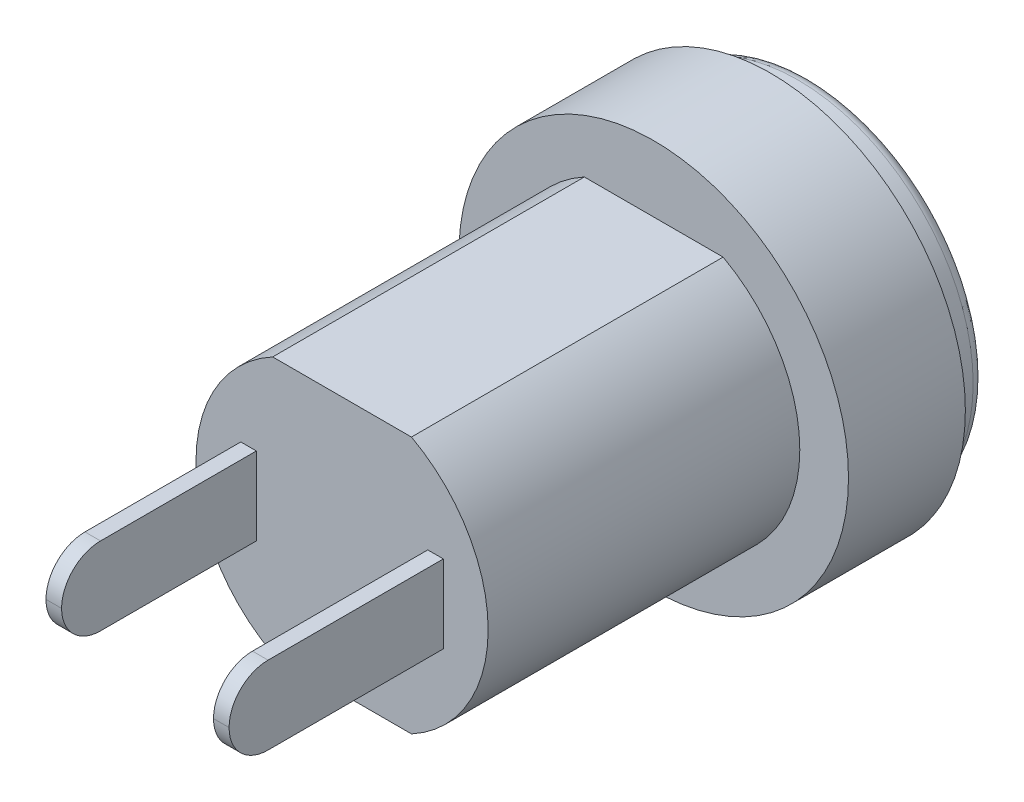
ISO-10303-21;
HEADER;
FILE_DESCRIPTION(('STEP AP214'),'2;1');
FILE_NAME('part.step','',(''),(''),'','','');
FILE_SCHEMA(('AUTOMOTIVE_DESIGN { 1 0 10303 214 1 1 1 1 }'));
ENDSEC;
DATA;
#1=APPLICATION_CONTEXT('core data for automotive mechanical design processes');
#2=APPLICATION_PROTOCOL_DEFINITION('international standard','automotive_design',2000,#1);
#3=PRODUCT_CONTEXT('',#1,'mechanical');
#4=PRODUCT('Part','Part','',(#3));
#5=PRODUCT_RELATED_PRODUCT_CATEGORY('part','',(#4));
#6=PRODUCT_DEFINITION_FORMATION('','',#4);
#7=PRODUCT_DEFINITION_CONTEXT('part definition',#1,'design');
#8=PRODUCT_DEFINITION('design','',#6,#7);
#9=PRODUCT_DEFINITION_SHAPE('','',#8);
#10=(LENGTH_UNIT() NAMED_UNIT(*) SI_UNIT(.MILLI.,.METRE.));
#11=(NAMED_UNIT(*) PLANE_ANGLE_UNIT() SI_UNIT($,.RADIAN.));
#12=(NAMED_UNIT(*) SI_UNIT($,.STERADIAN.) SOLID_ANGLE_UNIT());
#13=UNCERTAINTY_MEASURE_WITH_UNIT(LENGTH_MEASURE(1.E-05),#10,'distance_accuracy_value','');
#14=(GEOMETRIC_REPRESENTATION_CONTEXT(3) GLOBAL_UNCERTAINTY_ASSIGNED_CONTEXT((#13)) GLOBAL_UNIT_ASSIGNED_CONTEXT((#10,
#11,#12)) REPRESENTATION_CONTEXT('',''));
#15=CARTESIAN_POINT('',(0.,0.,0.));
#16=DIRECTION('',(0.,0.,1.));
#17=DIRECTION('',(1.,0.,0.));
#18=AXIS2_PLACEMENT_3D('',#15,#16,#17);
#19=CARTESIAN_POINT('',(0.,0.,11.));
#20=DIRECTION('',(0.,0.,1.));
#21=DIRECTION('',(1.,0.,0.));
#22=AXIS2_PLACEMENT_3D('',#19,#20,#21);
#23=PLANE('',#22);
#24=DIRECTION('',(-1.,0.,0.));
#25=VECTOR('',#24,1.);
#26=CARTESIAN_POINT('',(0.,-3.3,11.));
#27=LINE('',#26,#25);
#28=CARTESIAN_POINT('',(1.78115131305569,-3.3,11.));
#29=VERTEX_POINT('',#28);
#30=CARTESIAN_POINT('',(-1.78115131305569,-3.3,11.));
#31=VERTEX_POINT('',#30);
#32=EDGE_CURVE('E206',#29,#31,#27,.T.);
#33=ORIENTED_EDGE('',*,*,#32,.F.);
#34=CARTESIAN_POINT('',(0.,0.,11.));
#35=DIRECTION('',(0.,0.,1.));
#36=DIRECTION('',(1.,0.,0.));
#37=AXIS2_PLACEMENT_3D('',#34,#35,#36);
#38=CIRCLE('',#37,3.75);
#39=CARTESIAN_POINT('',(1.78115131305569,3.3,11.));
#40=VERTEX_POINT('',#39);
#41=EDGE_CURVE('E191',#29,#40,#38,.T.);
#42=ORIENTED_EDGE('',*,*,#41,.T.);
#43=DIRECTION('',(1.,0.,0.));
#44=VECTOR('',#43,1.);
#45=CARTESIAN_POINT('',(0.,3.3,11.));
#46=LINE('',#45,#44);
#47=CARTESIAN_POINT('',(-1.78115131305569,3.3,11.));
#48=VERTEX_POINT('',#47);
#49=EDGE_CURVE('E203',#48,#40,#46,.T.);
#50=ORIENTED_EDGE('',*,*,#49,.F.);
#51=EDGE_CURVE('E189',#48,#31,#38,.T.);
#52=ORIENTED_EDGE('',*,*,#51,.T.);
#53=EDGE_LOOP('',(#33,#42,#50,#52));
#54=FACE_BOUND('',#53,.T.);
#55=DIRECTION('',(-1.,0.,0.));
#56=VECTOR('',#55,1.);
#57=CARTESIAN_POINT('',(-2.6,1.,11.));
#58=LINE('',#57,#56);
#59=CARTESIAN_POINT('',(-2.2,1.,11.));
#60=VERTEX_POINT('',#59);
#61=CARTESIAN_POINT('',(-2.6,1.,11.));
#62=VERTEX_POINT('',#61);
#63=EDGE_CURVE('E156',#60,#62,#58,.T.);
#64=ORIENTED_EDGE('',*,*,#63,.F.);
#65=DIRECTION('',(0.,1.,0.));
#66=VECTOR('',#65,1.);
#67=CARTESIAN_POINT('',(-2.2,-1.,11.));
#68=LINE('',#67,#66);
#69=CARTESIAN_POINT('',(-2.2,-1.,11.));
#70=VERTEX_POINT('',#69);
#71=EDGE_CURVE('E127',#70,#60,#68,.T.);
#72=ORIENTED_EDGE('',*,*,#71,.F.);
#73=DIRECTION('',(1.,0.,0.));
#74=VECTOR('',#73,1.);
#75=CARTESIAN_POINT('',(-2.6,-1.,11.));
#76=LINE('',#75,#74);
#77=CARTESIAN_POINT('',(-2.6,-1.,11.));
#78=VERTEX_POINT('',#77);
#79=EDGE_CURVE('E165',#78,#70,#76,.T.);
#80=ORIENTED_EDGE('',*,*,#79,.F.);
#81=DIRECTION('',(0.,-1.,0.));
#82=VECTOR('',#81,1.);
#83=CARTESIAN_POINT('',(-2.6,-1.,11.));
#84=LINE('',#83,#82);
#85=EDGE_CURVE('E157',#62,#78,#84,.T.);
#86=ORIENTED_EDGE('',*,*,#85,.F.);
#87=EDGE_LOOP('',(#64,#72,#80,#86));
#88=FACE_BOUND('',#87,.T.);
#89=DIRECTION('',(-1.,0.,0.));
#90=VECTOR('',#89,1.);
#91=CARTESIAN_POINT('',(2.6,1.,11.));
#92=LINE('',#91,#90);
#93=CARTESIAN_POINT('',(2.6,1.,11.));
#94=VERTEX_POINT('',#93);
#95=CARTESIAN_POINT('',(2.2,1.,11.));
#96=VERTEX_POINT('',#95);
#97=EDGE_CURVE('E123',#94,#96,#92,.T.);
#98=ORIENTED_EDGE('',*,*,#97,.F.);
#99=DIRECTION('',(0.,1.,0.));
#100=VECTOR('',#99,1.);
#101=CARTESIAN_POINT('',(2.6,-1.,11.));
#102=LINE('',#101,#100);
#103=CARTESIAN_POINT('',(2.6,-1.,11.));
#104=VERTEX_POINT('',#103);
#105=EDGE_CURVE('E132',#104,#94,#102,.T.);
#106=ORIENTED_EDGE('',*,*,#105,.F.);
#107=DIRECTION('',(1.,0.,0.));
#108=VECTOR('',#107,1.);
#109=CARTESIAN_POINT('',(2.6,-1.,11.));
#110=LINE('',#109,#108);
#111=CARTESIAN_POINT('',(2.2,-1.,11.));
#112=VERTEX_POINT('',#111);
#113=EDGE_CURVE('E144',#112,#104,#110,.T.);
#114=ORIENTED_EDGE('',*,*,#113,.F.);
#115=DIRECTION('',(0.,-1.,0.));
#116=VECTOR('',#115,1.);
#117=CARTESIAN_POINT('',(2.2,-1.,11.));
#118=LINE('',#117,#116);
#119=EDGE_CURVE('E141',#96,#112,#118,.T.);
#120=ORIENTED_EDGE('',*,*,#119,.F.);
#121=EDGE_LOOP('',(#98,#106,#114,#120));
#122=FACE_BOUND('',#121,.T.);
#123=ADVANCED_FACE('F19',(#54,#88,#122),#23,.T.);
#124=CARTESIAN_POINT('',(0.,0.,11.));
#125=DIRECTION('',(0.,0.,-1.));
#126=DIRECTION('',(-1.,0.,0.));
#127=AXIS2_PLACEMENT_3D('',#124,#125,#126);
#128=CYLINDRICAL_SURFACE('',#127,3.75);
#129=ORIENTED_EDGE('',*,*,#41,.F.);
#130=DIRECTION('',(0.,0.,-1.));
#131=VECTOR('',#130,1.);
#132=CARTESIAN_POINT('',(1.78115131305569,-3.3,11.));
#133=LINE('',#132,#131);
#134=CARTESIAN_POINT('',(1.78115131305569,-3.3,3.));
#135=VERTEX_POINT('',#134);
#136=EDGE_CURVE('E180',#29,#135,#133,.T.);
#137=ORIENTED_EDGE('',*,*,#136,.T.);
#138=CARTESIAN_POINT('',(0.,0.,3.));
#139=DIRECTION('',(0.,0.,1.));
#140=DIRECTION('',(1.,0.,0.));
#141=AXIS2_PLACEMENT_3D('',#138,#139,#140);
#142=CIRCLE('',#141,3.75);
#143=CARTESIAN_POINT('',(1.78115131305569,3.3,3.));
#144=VERTEX_POINT('',#143);
#145=EDGE_CURVE('E188',#135,#144,#142,.T.);
#146=ORIENTED_EDGE('',*,*,#145,.T.);
#147=DIRECTION('',(0.,0.,-1.));
#148=VECTOR('',#147,1.);
#149=CARTESIAN_POINT('',(1.78115131305569,3.3,11.));
#150=LINE('',#149,#148);
#151=EDGE_CURVE('E183',#144,#40,#150,.F.);
#152=ORIENTED_EDGE('',*,*,#151,.T.);
#153=EDGE_LOOP('',(#129,#137,#146,#152));
#154=FACE_BOUND('',#153,.T.);
#155=ADVANCED_FACE('F262',(#154),#128,.T.);
#156=CARTESIAN_POINT('',(0.,0.,3.));
#157=DIRECTION('',(0.,0.,-1.));
#158=DIRECTION('',(-1.,0.,0.));
#159=AXIS2_PLACEMENT_3D('',#156,#157,#158);
#160=CYLINDRICAL_SURFACE('',#159,5.);
#161=CARTESIAN_POINT('',(0.,0.,3.));
#162=DIRECTION('',(0.,0.,1.));
#163=DIRECTION('',(1.,0.,0.));
#164=AXIS2_PLACEMENT_3D('',#161,#162,#163);
#165=CIRCLE('',#164,5.);
#166=CARTESIAN_POINT('',(5.,0.,3.));
#167=VERTEX_POINT('',#166);
#168=EDGE_CURVE('E196',#167,#167,#165,.T.);
#169=ORIENTED_EDGE('',*,*,#168,.F.);
#170=EDGE_LOOP('',(#169));
#171=FACE_BOUND('',#170,.T.);
#172=CARTESIAN_POINT('',(0.,0.,0.));
#173=DIRECTION('',(0.,0.,1.));
#174=DIRECTION('',(1.,0.,0.));
#175=AXIS2_PLACEMENT_3D('',#172,#173,#174);
#176=CIRCLE('',#175,5.);
#177=CARTESIAN_POINT('',(5.,0.,0.));
#178=VERTEX_POINT('',#177);
#179=EDGE_CURVE('E194',#178,#178,#176,.T.);
#180=ORIENTED_EDGE('',*,*,#179,.T.);
#181=EDGE_LOOP('',(#180));
#182=FACE_BOUND('',#181,.T.);
#183=ADVANCED_FACE('F275',(#171,#182),#160,.T.);
#184=CARTESIAN_POINT('',(0.,0.,3.));
#185=DIRECTION('',(0.,0.,1.));
#186=DIRECTION('',(1.,0.,0.));
#187=AXIS2_PLACEMENT_3D('',#184,#185,#186);
#188=PLANE('',#187);
#189=ORIENTED_EDGE('',*,*,#145,.F.);
#190=DIRECTION('',(1.,0.,0.));
#191=VECTOR('',#190,1.);
#192=CARTESIAN_POINT('',(-4.,-3.3,3.));
#193=LINE('',#192,#191);
#194=CARTESIAN_POINT('',(-1.78115131305569,-3.3,3.));
#195=VERTEX_POINT('',#194);
#196=EDGE_CURVE('E174',#195,#135,#193,.T.);
#197=ORIENTED_EDGE('',*,*,#196,.F.);
#198=CARTESIAN_POINT('',(-1.78115131305569,3.3,3.));
#199=VERTEX_POINT('',#198);
#200=EDGE_CURVE('E193',#199,#195,#142,.T.);
#201=ORIENTED_EDGE('',*,*,#200,.F.);
#202=DIRECTION('',(-1.,0.,0.));
#203=VECTOR('',#202,1.);
#204=CARTESIAN_POINT('',(-4.,3.3,3.));
#205=LINE('',#204,#203);
#206=EDGE_CURVE('E185',#144,#199,#205,.T.);
#207=ORIENTED_EDGE('',*,*,#206,.F.);
#208=EDGE_LOOP('',(#189,#197,#201,#207));
#209=FACE_BOUND('',#208,.T.);
#210=ORIENTED_EDGE('',*,*,#168,.T.);
#211=EDGE_LOOP('',(#210));
#212=FACE_BOUND('',#211,.T.);
#213=ADVANCED_FACE('F285',(#209,#212),#188,.T.);
#214=CARTESIAN_POINT('',(0.,0.,0.));
#215=DIRECTION('',(0.,0.,1.));
#216=DIRECTION('',(1.,0.,0.));
#217=AXIS2_PLACEMENT_3D('',#214,#215,#216);
#218=PLANE('',#217);
#219=CARTESIAN_POINT('',(0.,0.,0.));
#220=DIRECTION('',(0.,0.,1.));
#221=DIRECTION('',(1.,0.,0.));
#222=AXIS2_PLACEMENT_3D('',#219,#220,#221);
#223=CIRCLE('',#222,4.5);
#224=CARTESIAN_POINT('',(4.5,0.,0.));
#225=VERTEX_POINT('',#224);
#226=EDGE_CURVE('E230',#225,#225,#223,.F.);
#227=ORIENTED_EDGE('',*,*,#226,.F.);
#228=EDGE_LOOP('',(#227));
#229=FACE_BOUND('',#228,.T.);
#230=ORIENTED_EDGE('',*,*,#179,.F.);
#231=EDGE_LOOP('',(#230));
#232=FACE_BOUND('',#231,.T.);
#233=ADVANCED_FACE('F284',(#229,#232),#218,.F.);
#234=ORIENTED_EDGE('',*,*,#200,.T.);
#235=DIRECTION('',(0.,0.,-1.));
#236=VECTOR('',#235,1.);
#237=CARTESIAN_POINT('',(-1.78115131305569,-3.3,11.));
#238=LINE('',#237,#236);
#239=EDGE_CURVE('E175',#195,#31,#238,.F.);
#240=ORIENTED_EDGE('',*,*,#239,.T.);
#241=ORIENTED_EDGE('',*,*,#51,.F.);
#242=DIRECTION('',(0.,0.,-1.));
#243=VECTOR('',#242,1.);
#244=CARTESIAN_POINT('',(-1.78115131305569,3.3,11.));
#245=LINE('',#244,#243);
#246=EDGE_CURVE('E186',#48,#199,#245,.T.);
#247=ORIENTED_EDGE('',*,*,#246,.T.);
#248=EDGE_LOOP('',(#234,#240,#241,#247));
#249=FACE_BOUND('',#248,.T.);
#250=ADVANCED_FACE('F274',(#249),#128,.T.);
#251=CARTESIAN_POINT('',(-4.,3.3,-5.0504658250315));
#252=DIRECTION('',(0.,-1.,0.));
#253=DIRECTION('',(0.,0.,-1.));
#254=AXIS2_PLACEMENT_3D('',#251,#252,#253);
#255=PLANE('',#254);
#256=ORIENTED_EDGE('',*,*,#49,.T.);
#257=ORIENTED_EDGE('',*,*,#151,.F.);
#258=ORIENTED_EDGE('',*,*,#206,.T.);
#259=ORIENTED_EDGE('',*,*,#246,.F.);
#260=EDGE_LOOP('',(#256,#257,#258,#259));
#261=FACE_BOUND('',#260,.T.);
#262=ADVANCED_FACE('F276',(#261),#255,.F.);
#263=CARTESIAN_POINT('',(-4.,-3.3,-5.0504658250315));
#264=DIRECTION('',(0.,1.,0.));
#265=DIRECTION('',(0.,0.,1.));
#266=AXIS2_PLACEMENT_3D('',#263,#264,#265);
#267=PLANE('',#266);
#268=ORIENTED_EDGE('',*,*,#32,.T.);
#269=ORIENTED_EDGE('',*,*,#239,.F.);
#270=ORIENTED_EDGE('',*,*,#196,.T.);
#271=ORIENTED_EDGE('',*,*,#136,.F.);
#272=EDGE_LOOP('',(#268,#269,#270,#271));
#273=FACE_BOUND('',#272,.T.);
#274=ADVANCED_FACE('F374',(#273),#267,.F.);
#275=CARTESIAN_POINT('',(-2.2,-1.,16.));
#276=DIRECTION('',(-1.,0.,0.));
#277=DIRECTION('',(0.,0.,1.));
#278=AXIS2_PLACEMENT_3D('',#275,#276,#277);
#279=PLANE('',#278);
#280=DIRECTION('',(0.,0.,-1.));
#281=VECTOR('',#280,1.);
#282=CARTESIAN_POINT('',(-2.2,1.,16.));
#283=LINE('',#282,#281);
#284=CARTESIAN_POINT('',(-2.2,1.,15.));
#285=VERTEX_POINT('',#284);
#286=EDGE_CURVE('E171',#285,#60,#283,.T.);
#287=ORIENTED_EDGE('',*,*,#286,.F.);
#288=CARTESIAN_POINT('',(-2.2,0.,15.));
#289=DIRECTION('',(-1.,0.,0.));
#290=DIRECTION('',(0.,0.,1.));
#291=AXIS2_PLACEMENT_3D('',#288,#289,#290);
#292=CIRCLE('',#291,1.);
#293=CARTESIAN_POINT('',(-2.2,0.,16.));
#294=VERTEX_POINT('',#293);
#295=EDGE_CURVE('E39',#285,#294,#292,.F.);
#296=ORIENTED_EDGE('',*,*,#295,.T.);
#297=CARTESIAN_POINT('',(-2.2,0.,15.));
#298=DIRECTION('',(-1.,0.,0.));
#299=DIRECTION('',(0.,0.,1.));
#300=AXIS2_PLACEMENT_3D('',#297,#298,#299);
#301=CIRCLE('',#300,1.);
#302=CARTESIAN_POINT('',(-2.2,-1.,15.));
#303=VERTEX_POINT('',#302);
#304=EDGE_CURVE('E35',#294,#303,#301,.F.);
#305=ORIENTED_EDGE('',*,*,#304,.T.);
#306=DIRECTION('',(0.,0.,-1.));
#307=VECTOR('',#306,1.);
#308=CARTESIAN_POINT('',(-2.2,-1.,16.));
#309=LINE('',#308,#307);
#310=EDGE_CURVE('E164',#303,#70,#309,.T.);
#311=ORIENTED_EDGE('',*,*,#310,.T.);
#312=ORIENTED_EDGE('',*,*,#71,.T.);
#313=EDGE_LOOP('',(#287,#296,#305,#311,#312));
#314=FACE_BOUND('',#313,.T.);
#315=ADVANCED_FACE('F375',(#314),#279,.F.);
#316=CARTESIAN_POINT('',(-2.6,1.,16.));
#317=DIRECTION('',(0.,-1.,0.));
#318=DIRECTION('',(0.,0.,-1.));
#319=AXIS2_PLACEMENT_3D('',#316,#317,#318);
#320=PLANE('',#319);
#321=DIRECTION('',(0.,0.,-1.));
#322=VECTOR('',#321,1.);
#323=CARTESIAN_POINT('',(-2.6,1.,16.));
#324=LINE('',#323,#322);
#325=CARTESIAN_POINT('',(-2.6,1.,15.));
#326=VERTEX_POINT('',#325);
#327=EDGE_CURVE('E166',#326,#62,#324,.T.);
#328=ORIENTED_EDGE('',*,*,#327,.F.);
#329=DIRECTION('',(-1.,0.,0.));
#330=VECTOR('',#329,1.);
#331=CARTESIAN_POINT('',(-2.6,1.,15.));
#332=LINE('',#331,#330);
#333=EDGE_CURVE('E224',#326,#285,#332,.F.);
#334=ORIENTED_EDGE('',*,*,#333,.T.);
#335=ORIENTED_EDGE('',*,*,#286,.T.);
#336=ORIENTED_EDGE('',*,*,#63,.T.);
#337=EDGE_LOOP('',(#328,#334,#335,#336));
#338=FACE_BOUND('',#337,.T.);
#339=ADVANCED_FACE('F366',(#338),#320,.F.);
#340=CARTESIAN_POINT('',(-2.6,-1.,16.));
#341=DIRECTION('',(1.,0.,0.));
#342=DIRECTION('',(0.,0.,-1.));
#343=AXIS2_PLACEMENT_3D('',#340,#341,#342);
#344=PLANE('',#343);
#345=CARTESIAN_POINT('',(-2.6,0.,15.));
#346=DIRECTION('',(1.,0.,0.));
#347=DIRECTION('',(0.,0.,-1.));
#348=AXIS2_PLACEMENT_3D('',#345,#346,#347);
#349=CIRCLE('',#348,1.);
#350=CARTESIAN_POINT('',(-2.6,-1.,15.));
#351=VERTEX_POINT('',#350);
#352=CARTESIAN_POINT('',(-2.6,0.,16.));
#353=VERTEX_POINT('',#352);
#354=EDGE_CURVE('E218',#351,#353,#349,.F.);
#355=ORIENTED_EDGE('',*,*,#354,.T.);
#356=CARTESIAN_POINT('',(-2.6,0.,15.));
#357=DIRECTION('',(1.,0.,0.));
#358=DIRECTION('',(0.,0.,-1.));
#359=AXIS2_PLACEMENT_3D('',#356,#357,#358);
#360=CIRCLE('',#359,1.);
#361=EDGE_CURVE('E222',#353,#326,#360,.F.);
#362=ORIENTED_EDGE('',*,*,#361,.T.);
#363=ORIENTED_EDGE('',*,*,#327,.T.);
#364=ORIENTED_EDGE('',*,*,#85,.T.);
#365=DIRECTION('',(0.,0.,-1.));
#366=VECTOR('',#365,1.);
#367=CARTESIAN_POINT('',(-2.6,-1.,16.));
#368=LINE('',#367,#366);
#369=EDGE_CURVE('E170',#351,#78,#368,.T.);
#370=ORIENTED_EDGE('',*,*,#369,.F.);
#371=EDGE_LOOP('',(#355,#362,#363,#364,#370));
#372=FACE_BOUND('',#371,.T.);
#373=ADVANCED_FACE('F365',(#372),#344,.F.);
#374=CARTESIAN_POINT('',(-2.6,-1.,16.));
#375=DIRECTION('',(0.,1.,0.));
#376=DIRECTION('',(0.,0.,1.));
#377=AXIS2_PLACEMENT_3D('',#374,#375,#376);
#378=PLANE('',#377);
#379=ORIENTED_EDGE('',*,*,#310,.F.);
#380=DIRECTION('',(1.,0.,0.));
#381=VECTOR('',#380,1.);
#382=CARTESIAN_POINT('',(-2.6,-1.,15.));
#383=LINE('',#382,#381);
#384=EDGE_CURVE('E229',#303,#351,#383,.F.);
#385=ORIENTED_EDGE('',*,*,#384,.T.);
#386=ORIENTED_EDGE('',*,*,#369,.T.);
#387=ORIENTED_EDGE('',*,*,#79,.T.);
#388=EDGE_LOOP('',(#379,#385,#386,#387));
#389=FACE_BOUND('',#388,.T.);
#390=ADVANCED_FACE('F363',(#389),#378,.F.);
#391=CARTESIAN_POINT('',(2.6,-1.,16.));
#392=DIRECTION('',(-1.,0.,0.));
#393=DIRECTION('',(0.,0.,1.));
#394=AXIS2_PLACEMENT_3D('',#391,#392,#393);
#395=PLANE('',#394);
#396=DIRECTION('',(0.,0.,-1.));
#397=VECTOR('',#396,1.);
#398=CARTESIAN_POINT('',(2.6,1.,16.));
#399=LINE('',#398,#397);
#400=CARTESIAN_POINT('',(2.6,1.,15.5));
#401=VERTEX_POINT('',#400);
#402=EDGE_CURVE('E118',#401,#94,#399,.T.);
#403=ORIENTED_EDGE('',*,*,#402,.F.);
#404=CARTESIAN_POINT('',(2.6,0.,15.5));
#405=DIRECTION('',(-1.,0.,0.));
#406=DIRECTION('',(0.,0.,1.));
#407=AXIS2_PLACEMENT_3D('',#404,#405,#406);
#408=CIRCLE('',#407,1.);
#409=CARTESIAN_POINT('',(2.6,0.,16.5));
#410=VERTEX_POINT('',#409);
#411=EDGE_CURVE('E214',#401,#410,#408,.F.);
#412=ORIENTED_EDGE('',*,*,#411,.T.);
#413=CARTESIAN_POINT('',(2.6,0.,15.5));
#414=DIRECTION('',(-1.,0.,0.));
#415=DIRECTION('',(0.,0.,1.));
#416=AXIS2_PLACEMENT_3D('',#413,#414,#415);
#417=CIRCLE('',#416,1.);
#418=CARTESIAN_POINT('',(2.6,-1.,15.5));
#419=VERTEX_POINT('',#418);
#420=EDGE_CURVE('E213',#410,#419,#417,.F.);
#421=ORIENTED_EDGE('',*,*,#420,.T.);
#422=DIRECTION('',(0.,0.,-1.));
#423=VECTOR('',#422,1.);
#424=CARTESIAN_POINT('',(2.6,-1.,16.));
#425=LINE('',#424,#423);
#426=EDGE_CURVE('E137',#419,#104,#425,.T.);
#427=ORIENTED_EDGE('',*,*,#426,.T.);
#428=ORIENTED_EDGE('',*,*,#105,.T.);
#429=EDGE_LOOP('',(#403,#412,#421,#427,#428));
#430=FACE_BOUND('',#429,.T.);
#431=ADVANCED_FACE('F133',(#430),#395,.F.);
#432=CARTESIAN_POINT('',(2.6,1.,16.));
#433=DIRECTION('',(0.,-1.,0.));
#434=DIRECTION('',(1.,0.,0.));
#435=AXIS2_PLACEMENT_3D('',#432,#433,#434);
#436=PLANE('',#435);
#437=DIRECTION('',(0.,0.,-1.));
#438=VECTOR('',#437,1.);
#439=CARTESIAN_POINT('',(2.2,1.,16.));
#440=LINE('',#439,#438);
#441=CARTESIAN_POINT('',(2.2,1.,15.5));
#442=VERTEX_POINT('',#441);
#443=EDGE_CURVE('E129',#442,#96,#440,.T.);
#444=ORIENTED_EDGE('',*,*,#443,.F.);
#445=DIRECTION('',(-1.,0.,0.));
#446=VECTOR('',#445,1.);
#447=CARTESIAN_POINT('',(2.6,1.,15.5));
#448=LINE('',#447,#446);
#449=EDGE_CURVE('E126',#442,#401,#448,.F.);
#450=ORIENTED_EDGE('',*,*,#449,.T.);
#451=ORIENTED_EDGE('',*,*,#402,.T.);
#452=ORIENTED_EDGE('',*,*,#97,.T.);
#453=EDGE_LOOP('',(#444,#450,#451,#452));
#454=FACE_BOUND('',#453,.T.);
#455=ADVANCED_FACE('F121',(#454),#436,.F.);
#456=CARTESIAN_POINT('',(2.2,-1.,16.));
#457=DIRECTION('',(1.,0.,0.));
#458=DIRECTION('',(0.,0.,-1.));
#459=AXIS2_PLACEMENT_3D('',#456,#457,#458);
#460=PLANE('',#459);
#461=CARTESIAN_POINT('',(2.2,0.,15.5));
#462=DIRECTION('',(1.,0.,0.));
#463=DIRECTION('',(0.,0.,-1.));
#464=AXIS2_PLACEMENT_3D('',#461,#462,#463);
#465=CIRCLE('',#464,1.);
#466=CARTESIAN_POINT('',(2.2,-1.,15.5));
#467=VERTEX_POINT('',#466);
#468=CARTESIAN_POINT('',(2.2,0.,16.5));
#469=VERTEX_POINT('',#468);
#470=EDGE_CURVE('E208',#467,#469,#465,.F.);
#471=ORIENTED_EDGE('',*,*,#470,.T.);
#472=CARTESIAN_POINT('',(2.2,0.,15.5));
#473=DIRECTION('',(1.,0.,0.));
#474=DIRECTION('',(0.,0.,-1.));
#475=AXIS2_PLACEMENT_3D('',#472,#473,#474);
#476=CIRCLE('',#475,1.);
#477=EDGE_CURVE('E209',#469,#442,#476,.F.);
#478=ORIENTED_EDGE('',*,*,#477,.T.);
#479=ORIENTED_EDGE('',*,*,#443,.T.);
#480=ORIENTED_EDGE('',*,*,#119,.T.);
#481=DIRECTION('',(0.,0.,-1.));
#482=VECTOR('',#481,1.);
#483=CARTESIAN_POINT('',(2.2,-1.,16.));
#484=LINE('',#483,#482);
#485=EDGE_CURVE('E151',#467,#112,#484,.T.);
#486=ORIENTED_EDGE('',*,*,#485,.F.);
#487=EDGE_LOOP('',(#471,#478,#479,#480,#486));
#488=FACE_BOUND('',#487,.T.);
#489=ADVANCED_FACE('F355',(#488),#460,.F.);
#490=CARTESIAN_POINT('',(2.6,-1.,16.));
#491=DIRECTION('',(0.,1.,0.));
#492=DIRECTION('',(-1.,0.,0.));
#493=AXIS2_PLACEMENT_3D('',#490,#491,#492);
#494=PLANE('',#493);
#495=ORIENTED_EDGE('',*,*,#426,.F.);
#496=DIRECTION('',(1.,0.,0.));
#497=VECTOR('',#496,1.);
#498=CARTESIAN_POINT('',(2.2,-1.,15.5));
#499=LINE('',#498,#497);
#500=EDGE_CURVE('E220',#419,#467,#499,.F.);
#501=ORIENTED_EDGE('',*,*,#500,.T.);
#502=ORIENTED_EDGE('',*,*,#485,.T.);
#503=ORIENTED_EDGE('',*,*,#113,.T.);
#504=EDGE_LOOP('',(#495,#501,#502,#503));
#505=FACE_BOUND('',#504,.T.);
#506=ADVANCED_FACE('F304',(#505),#494,.F.);
#507=CARTESIAN_POINT('',(0.,0.,15.5));
#508=DIRECTION('',(-1.,0.,0.));
#509=DIRECTION('',(0.,-1.,0.));
#510=AXIS2_PLACEMENT_3D('',#507,#508,#509);
#511=CYLINDRICAL_SURFACE('',#510,1.);
#512=ORIENTED_EDGE('',*,*,#500,.F.);
#513=ORIENTED_EDGE('',*,*,#420,.F.);
#514=DIRECTION('',(1.,0.,0.));
#515=VECTOR('',#514,1.);
#516=CARTESIAN_POINT('',(2.6,0.,16.5));
#517=LINE('',#516,#515);
#518=EDGE_CURVE('E138',#469,#410,#517,.T.);
#519=ORIENTED_EDGE('',*,*,#518,.F.);
#520=ORIENTED_EDGE('',*,*,#470,.F.);
#521=EDGE_LOOP('',(#512,#513,#519,#520));
#522=FACE_BOUND('',#521,.T.);
#523=ADVANCED_FACE('F298',(#522),#511,.T.);
#524=CARTESIAN_POINT('',(0.,0.,15.5));
#525=DIRECTION('',(1.,0.,0.));
#526=DIRECTION('',(0.,1.,0.));
#527=AXIS2_PLACEMENT_3D('',#524,#525,#526);
#528=CYLINDRICAL_SURFACE('',#527,1.);
#529=ORIENTED_EDGE('',*,*,#411,.F.);
#530=ORIENTED_EDGE('',*,*,#449,.F.);
#531=ORIENTED_EDGE('',*,*,#477,.F.);
#532=ORIENTED_EDGE('',*,*,#518,.T.);
#533=EDGE_LOOP('',(#529,#530,#531,#532));
#534=FACE_BOUND('',#533,.T.);
#535=ADVANCED_FACE('F294',(#534),#528,.T.);
#536=CARTESIAN_POINT('',(0.,0.,15.));
#537=DIRECTION('',(1.,0.,0.));
#538=DIRECTION('',(0.,0.,-1.));
#539=AXIS2_PLACEMENT_3D('',#536,#537,#538);
#540=CYLINDRICAL_SURFACE('',#539,1.);
#541=ORIENTED_EDGE('',*,*,#384,.F.);
#542=ORIENTED_EDGE('',*,*,#304,.F.);
#543=DIRECTION('',(1.,0.,0.));
#544=VECTOR('',#543,1.);
#545=CARTESIAN_POINT('',(0.,0.,16.));
#546=LINE('',#545,#544);
#547=EDGE_CURVE('E235',#353,#294,#546,.T.);
#548=ORIENTED_EDGE('',*,*,#547,.F.);
#549=ORIENTED_EDGE('',*,*,#354,.F.);
#550=EDGE_LOOP('',(#541,#542,#548,#549));
#551=FACE_BOUND('',#550,.T.);
#552=ADVANCED_FACE('F297',(#551),#540,.T.);
#553=CARTESIAN_POINT('',(0.,0.,15.));
#554=DIRECTION('',(-1.,0.,0.));
#555=DIRECTION('',(0.,0.,1.));
#556=AXIS2_PLACEMENT_3D('',#553,#554,#555);
#557=CYLINDRICAL_SURFACE('',#556,1.);
#558=ORIENTED_EDGE('',*,*,#295,.F.);
#559=ORIENTED_EDGE('',*,*,#333,.F.);
#560=ORIENTED_EDGE('',*,*,#361,.F.);
#561=ORIENTED_EDGE('',*,*,#547,.T.);
#562=EDGE_LOOP('',(#558,#559,#560,#561));
#563=FACE_BOUND('',#562,.T.);
#564=ADVANCED_FACE('F303',(#563),#557,.T.);
#565=CARTESIAN_POINT('',(0.,0.,-1.));
#566=DIRECTION('',(0.,0.,-1.));
#567=DIRECTION('',(-1.,0.,0.));
#568=AXIS2_PLACEMENT_3D('',#565,#566,#567);
#569=PLANE('',#568);
#570=CARTESIAN_POINT('',(0.,0.,-1.));
#571=DIRECTION('',(0.,0.,-1.));
#572=DIRECTION('',(-1.,0.,0.));
#573=AXIS2_PLACEMENT_3D('',#570,#571,#572);
#574=CIRCLE('',#573,3.25);
#575=CARTESIAN_POINT('',(-3.25,0.,-1.));
#576=VERTEX_POINT('',#575);
#577=EDGE_CURVE('E12',#576,#576,#574,.F.);
#578=ORIENTED_EDGE('',*,*,#577,.T.);
#579=EDGE_LOOP('',(#578));
#580=FACE_BOUND('',#579,.T.);
#581=CARTESIAN_POINT('',(0.,0.,-1.));
#582=DIRECTION('',(0.,0.,-1.));
#583=DIRECTION('',(-1.,0.,0.));
#584=AXIS2_PLACEMENT_3D('',#581,#582,#583);
#585=CIRCLE('',#584,4.2);
#586=CARTESIAN_POINT('',(-4.2,0.,-1.));
#587=VERTEX_POINT('',#586);
#588=EDGE_CURVE('E245',#587,#587,#585,.T.);
#589=ORIENTED_EDGE('',*,*,#588,.T.);
#590=EDGE_LOOP('',(#589));
#591=FACE_BOUND('',#590,.T.);
#592=ADVANCED_FACE('F306',(#580,#591),#569,.T.);
#593=CARTESIAN_POINT('',(0.,0.,-1.));
#594=DIRECTION('',(0.,0.,1.));
#595=DIRECTION('',(1.,0.,0.));
#596=AXIS2_PLACEMENT_3D('',#593,#594,#595);
#597=CYLINDRICAL_SURFACE('',#596,4.5);
#598=CARTESIAN_POINT('',(0.,0.,-0.7));
#599=DIRECTION('',(0.,0.,-1.));
#600=DIRECTION('',(-1.,0.,0.));
#601=AXIS2_PLACEMENT_3D('',#598,#599,#600);
#602=CIRCLE('',#601,4.5);
#603=CARTESIAN_POINT('',(-4.5,0.,-0.7));
#604=VERTEX_POINT('',#603);
#605=EDGE_CURVE('E244',#604,#604,#602,.F.);
#606=ORIENTED_EDGE('',*,*,#605,.T.);
#607=EDGE_LOOP('',(#606));
#608=FACE_BOUND('',#607,.T.);
#609=ORIENTED_EDGE('',*,*,#226,.T.);
#610=EDGE_LOOP('',(#609));
#611=FACE_BOUND('',#610,.T.);
#612=ADVANCED_FACE('F337',(#608,#611),#597,.T.);
#613=CARTESIAN_POINT('',(0.,0.,-1.));
#614=DIRECTION('',(0.,0.,1.));
#615=DIRECTION('',(1.,0.,0.));
#616=AXIS2_PLACEMENT_3D('',#613,#614,#615);
#617=CYLINDRICAL_SURFACE('',#616,2.75);
#618=CARTESIAN_POINT('',(0.,0.,-0.5));
#619=DIRECTION('',(0.,0.,-1.));
#620=DIRECTION('',(-1.,0.,0.));
#621=AXIS2_PLACEMENT_3D('',#618,#619,#620);
#622=CIRCLE('',#621,2.75);
#623=CARTESIAN_POINT('',(-2.75,0.,-0.5));
#624=VERTEX_POINT('',#623);
#625=EDGE_CURVE('E30',#624,#624,#622,.T.);
#626=ORIENTED_EDGE('',*,*,#625,.T.);
#627=EDGE_LOOP('',(#626));
#628=FACE_BOUND('',#627,.T.);
#629=CARTESIAN_POINT('',(0.,0.,10.));
#630=DIRECTION('',(0.,0.,1.));
#631=DIRECTION('',(1.,0.,0.));
#632=AXIS2_PLACEMENT_3D('',#629,#630,#631);
#633=CIRCLE('',#632,2.75);
#634=CARTESIAN_POINT('',(2.75,0.,10.));
#635=VERTEX_POINT('',#634);
#636=EDGE_CURVE('E335',#635,#635,#633,.F.);
#637=ORIENTED_EDGE('',*,*,#636,.F.);
#638=EDGE_LOOP('',(#637));
#639=FACE_BOUND('',#638,.T.);
#640=ADVANCED_FACE('F248',(#628,#639),#617,.F.);
#641=CARTESIAN_POINT('',(0.,0.,18.778174593052));
#642=DIRECTION('',(0.,0.,-1.));
#643=DIRECTION('',(-1.,0.,0.));
#644=AXIS2_PLACEMENT_3D('',#641,#642,#643);
#645=CYLINDRICAL_SURFACE('',#644,1.25);
#646=CARTESIAN_POINT('',(0.,0.,1.25));
#647=DIRECTION('',(0.,0.,-1.));
#648=DIRECTION('',(-1.,0.,0.));
#649=AXIS2_PLACEMENT_3D('',#646,#647,#648);
#650=CIRCLE('',#649,1.25);
#651=CARTESIAN_POINT('',(-1.25,0.,1.25));
#652=VERTEX_POINT('',#651);
#653=EDGE_CURVE('E237',#652,#652,#650,.F.);
#654=ORIENTED_EDGE('',*,*,#653,.T.);
#655=EDGE_LOOP('',(#654));
#656=FACE_BOUND('',#655,.T.);
#657=CARTESIAN_POINT('',(0.,0.,10.));
#658=DIRECTION('',(0.,0.,1.));
#659=DIRECTION('',(1.,0.,0.));
#660=AXIS2_PLACEMENT_3D('',#657,#658,#659);
#661=CIRCLE('',#660,1.25);
#662=CARTESIAN_POINT('',(1.25,0.,10.));
#663=VERTEX_POINT('',#662);
#664=EDGE_CURVE('E240',#663,#663,#661,.F.);
#665=ORIENTED_EDGE('',*,*,#664,.T.);
#666=EDGE_LOOP('',(#665));
#667=FACE_BOUND('',#666,.T.);
#668=ADVANCED_FACE('F321',(#656,#667),#645,.T.);
#669=CARTESIAN_POINT('',(0.,0.,10.));
#670=DIRECTION('',(0.,0.,1.));
#671=DIRECTION('',(1.,0.,0.));
#672=AXIS2_PLACEMENT_3D('',#669,#670,#671);
#673=PLANE('',#672);
#674=ORIENTED_EDGE('',*,*,#636,.T.);
#675=EDGE_LOOP('',(#674));
#676=FACE_BOUND('',#675,.T.);
#677=ORIENTED_EDGE('',*,*,#664,.F.);
#678=EDGE_LOOP('',(#677));
#679=FACE_BOUND('',#678,.T.);
#680=ADVANCED_FACE('F314',(#676,#679),#673,.F.);
#681=CARTESIAN_POINT('',(0.,0.,1.25));
#682=DIRECTION('',(0.,0.,1.));
#683=DIRECTION('',(1.,0.,0.));
#684=AXIS2_PLACEMENT_3D('',#681,#682,#683);
#685=SPHERICAL_SURFACE('',#684,1.25);
#686=ORIENTED_EDGE('',*,*,#653,.F.);
#687=EDGE_LOOP('',(#686));
#688=FACE_BOUND('',#687,.T.);
#689=ADVANCED_FACE('F257',(#688),#685,.T.);
#690=CARTESIAN_POINT('',(0.,0.,-0.7));
#691=DIRECTION('',(0.,0.,-1.));
#692=DIRECTION('',(-1.,0.,0.));
#693=AXIS2_PLACEMENT_3D('',#690,#691,#692);
#694=TOROIDAL_SURFACE('',#693,4.2,0.3);
#695=ORIENTED_EDGE('',*,*,#605,.F.);
#696=EDGE_LOOP('',(#695));
#697=FACE_BOUND('',#696,.T.);
#698=ORIENTED_EDGE('',*,*,#588,.F.);
#699=EDGE_LOOP('',(#698));
#700=FACE_BOUND('',#699,.T.);
#701=ADVANCED_FACE('F255',(#697,#700),#694,.T.);
#702=CARTESIAN_POINT('',(0.,0.,-0.5));
#703=DIRECTION('',(0.,0.,-1.));
#704=DIRECTION('',(-1.,0.,0.));
#705=AXIS2_PLACEMENT_3D('',#702,#703,#704);
#706=CONICAL_SURFACE('',#705,2.75,0.785398163397449);
#707=ORIENTED_EDGE('',*,*,#577,.F.);
#708=EDGE_LOOP('',(#707));
#709=FACE_BOUND('',#708,.T.);
#710=ORIENTED_EDGE('',*,*,#625,.F.);
#711=EDGE_LOOP('',(#710));
#712=FACE_BOUND('',#711,.T.);
#713=ADVANCED_FACE('F21',(#709,#712),#706,.F.);
#714=CLOSED_SHELL('',(#123,#155,#183,#213,#233,#250,#262,#274,#315,#339,#373,#390,#431,#455,
#489,#506,#523,#535,#552,#564,#592,#612,#640,#668,#680,#689,#701,#713));
#715=MANIFOLD_SOLID_BREP('B1',#714);
#716=ADVANCED_BREP_SHAPE_REPRESENTATION('',(#18,#715),#14);
#717=SHAPE_DEFINITION_REPRESENTATION(#9,#716);
ENDSEC;
END-ISO-10303-21;
